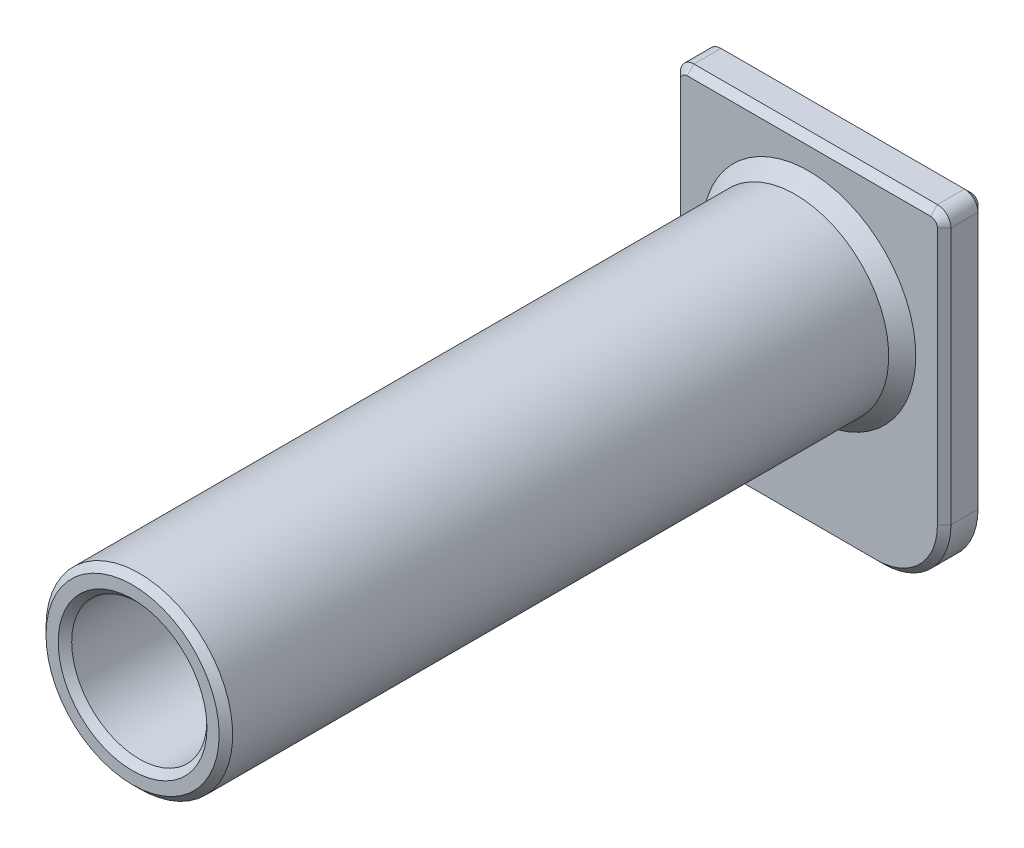
ISO-10303-21;
HEADER;
FILE_DESCRIPTION(('STEP AP214'),'2;1');
FILE_NAME('part.step','',(''),(''),'','','');
FILE_SCHEMA(('AUTOMOTIVE_DESIGN { 1 0 10303 214 1 1 1 1 }'));
ENDSEC;
DATA;
#1=APPLICATION_CONTEXT('core data for automotive mechanical design processes');
#2=APPLICATION_PROTOCOL_DEFINITION('international standard','automotive_design',2000,#1);
#3=PRODUCT_CONTEXT('',#1,'mechanical');
#4=PRODUCT('Part','Part','',(#3));
#5=PRODUCT_RELATED_PRODUCT_CATEGORY('part','',(#4));
#6=PRODUCT_DEFINITION_FORMATION('','',#4);
#7=PRODUCT_DEFINITION_CONTEXT('part definition',#1,'design');
#8=PRODUCT_DEFINITION('design','',#6,#7);
#9=PRODUCT_DEFINITION_SHAPE('','',#8);
#10=(LENGTH_UNIT() NAMED_UNIT(*) SI_UNIT(.MILLI.,.METRE.));
#11=(NAMED_UNIT(*) PLANE_ANGLE_UNIT() SI_UNIT($,.RADIAN.));
#12=(NAMED_UNIT(*) SI_UNIT($,.STERADIAN.) SOLID_ANGLE_UNIT());
#13=UNCERTAINTY_MEASURE_WITH_UNIT(LENGTH_MEASURE(1.E-05),#10,'distance_accuracy_value','');
#14=(GEOMETRIC_REPRESENTATION_CONTEXT(3) GLOBAL_UNCERTAINTY_ASSIGNED_CONTEXT((#13)) GLOBAL_UNIT_ASSIGNED_CONTEXT((#10,
#11,#12)) REPRESENTATION_CONTEXT('',''));
#15=CARTESIAN_POINT('',(0.,0.,0.));
#16=DIRECTION('',(0.,0.,1.));
#17=DIRECTION('',(1.,0.,0.));
#18=AXIS2_PLACEMENT_3D('',#15,#16,#17);
#19=CARTESIAN_POINT('',(0.,138.860814374171,3.));
#20=DIRECTION('',(0.,1.,0.));
#21=DIRECTION('',(0.,0.,1.));
#22=AXIS2_PLACEMENT_3D('',#19,#20,#21);
#23=PLANE('',#22);
#24=DIRECTION('',(0.,0.,-1.));
#25=VECTOR('',#24,1.);
#26=CARTESIAN_POINT('',(102.765440340665,138.860814374171,3.));
#27=LINE('',#26,#25);
#28=CARTESIAN_POINT('',(102.765440340665,138.860814374171,2.5));
#29=VERTEX_POINT('',#28);
#30=CARTESIAN_POINT('',(102.765440340665,138.860814374171,0.500000000000014));
#31=VERTEX_POINT('',#30);
#32=EDGE_CURVE('E172',#29,#31,#27,.T.);
#33=ORIENTED_EDGE('',*,*,#32,.F.);
#34=DIRECTION('',(1.,0.,0.));
#35=VECTOR('',#34,1.);
#36=CARTESIAN_POINT('',(0.,138.860814374171,2.5));
#37=LINE('',#36,#35);
#38=CARTESIAN_POINT('',(120.765440340665,138.860814374171,2.5));
#39=VERTEX_POINT('',#38);
#40=EDGE_CURVE('E170',#29,#39,#37,.T.);
#41=ORIENTED_EDGE('',*,*,#40,.T.);
#42=DIRECTION('',(0.,0.,-1.));
#43=VECTOR('',#42,1.);
#44=CARTESIAN_POINT('',(120.765440340665,138.860814374171,3.));
#45=LINE('',#44,#43);
#46=CARTESIAN_POINT('',(120.765440340665,138.860814374171,0.500000000000014));
#47=VERTEX_POINT('',#46);
#48=EDGE_CURVE('E166',#39,#47,#45,.T.);
#49=ORIENTED_EDGE('',*,*,#48,.T.);
#50=DIRECTION('',(-1.,0.,0.));
#51=VECTOR('',#50,1.);
#52=CARTESIAN_POINT('',(102.765440340665,138.860814374171,0.500000000000014));
#53=LINE('',#52,#51);
#54=EDGE_CURVE('E180',#47,#31,#53,.T.);
#55=ORIENTED_EDGE('',*,*,#54,.T.);
#56=EDGE_LOOP('',(#33,#41,#49,#55));
#57=FACE_BOUND('',#56,.T.);
#58=ADVANCED_FACE('F51',(#57),#23,.T.);
#59=CARTESIAN_POINT('',(102.765440340665,137.860814374171,3.));
#60=DIRECTION('',(0.,0.,-1.));
#61=DIRECTION('',(-1.,0.,0.));
#62=AXIS2_PLACEMENT_3D('',#59,#60,#61);
#63=CYLINDRICAL_SURFACE('',#62,1.);
#64=DIRECTION('',(0.,0.,-1.));
#65=VECTOR('',#64,1.);
#66=CARTESIAN_POINT('',(101.765440340665,137.860814374171,3.));
#67=LINE('',#66,#65);
#68=CARTESIAN_POINT('',(101.765440340665,137.860814374171,2.5));
#69=VERTEX_POINT('',#68);
#70=CARTESIAN_POINT('',(101.765440340665,137.860814374171,0.500000000000014));
#71=VERTEX_POINT('',#70);
#72=EDGE_CURVE('E580',#69,#71,#67,.T.);
#73=ORIENTED_EDGE('',*,*,#72,.F.);
#74=CARTESIAN_POINT('',(102.765440340665,137.860814374171,2.5));
#75=DIRECTION('',(0.,0.,1.));
#76=DIRECTION('',(1.,0.,0.));
#77=AXIS2_PLACEMENT_3D('',#74,#75,#76);
#78=CIRCLE('',#77,1.);
#79=EDGE_CURVE('E272',#69,#29,#78,.F.);
#80=ORIENTED_EDGE('',*,*,#79,.T.);
#81=ORIENTED_EDGE('',*,*,#32,.T.);
#82=CARTESIAN_POINT('',(102.765440340665,137.860814374171,0.500000000000014));
#83=DIRECTION('',(0.,0.,1.));
#84=DIRECTION('',(1.,0.,0.));
#85=AXIS2_PLACEMENT_3D('',#82,#83,#84);
#86=CIRCLE('',#85,1.);
#87=EDGE_CURVE('E267',#31,#71,#86,.T.);
#88=ORIENTED_EDGE('',*,*,#87,.T.);
#89=EDGE_LOOP('',(#73,#80,#81,#88));
#90=FACE_BOUND('',#89,.T.);
#91=ADVANCED_FACE('F388',(#90),#63,.T.);
#92=CARTESIAN_POINT('',(101.765440340665,0.,3.));
#93=DIRECTION('',(1.,0.,0.));
#94=DIRECTION('',(0.,0.,-1.));
#95=AXIS2_PLACEMENT_3D('',#92,#93,#94);
#96=PLANE('',#95);
#97=DIRECTION('',(0.,0.,-1.));
#98=VECTOR('',#97,1.);
#99=CARTESIAN_POINT('',(101.765440340665,118.860814374171,3.));
#100=LINE('',#99,#98);
#101=CARTESIAN_POINT('',(101.765440340665,118.860814374171,2.5));
#102=VERTEX_POINT('',#101);
#103=CARTESIAN_POINT('',(101.765440340665,118.860814374171,0.500000000000014));
#104=VERTEX_POINT('',#103);
#105=EDGE_CURVE('E571',#102,#104,#100,.T.);
#106=ORIENTED_EDGE('',*,*,#105,.F.);
#107=DIRECTION('',(0.,1.,0.));
#108=VECTOR('',#107,1.);
#109=CARTESIAN_POINT('',(101.765440340665,137.860814374171,2.5));
#110=LINE('',#109,#108);
#111=EDGE_CURVE('E266',#102,#69,#110,.T.);
#112=ORIENTED_EDGE('',*,*,#111,.T.);
#113=ORIENTED_EDGE('',*,*,#72,.T.);
#114=DIRECTION('',(0.,-1.,0.));
#115=VECTOR('',#114,1.);
#116=CARTESIAN_POINT('',(101.765440340665,0.,0.500000000000014));
#117=LINE('',#116,#115);
#118=EDGE_CURVE('E263',#71,#104,#117,.T.);
#119=ORIENTED_EDGE('',*,*,#118,.T.);
#120=EDGE_LOOP('',(#106,#112,#113,#119));
#121=FACE_BOUND('',#120,.T.);
#122=ADVANCED_FACE('F393',(#121),#96,.F.);
#123=CARTESIAN_POINT('',(106.765440340665,118.860814374171,3.));
#124=DIRECTION('',(0.,0.,-1.));
#125=DIRECTION('',(-1.,0.,0.));
#126=AXIS2_PLACEMENT_3D('',#123,#124,#125);
#127=CYLINDRICAL_SURFACE('',#126,5.);
#128=DIRECTION('',(0.,0.,-1.));
#129=VECTOR('',#128,1.);
#130=CARTESIAN_POINT('',(106.765440340665,113.860814374171,3.));
#131=LINE('',#130,#129);
#132=CARTESIAN_POINT('',(106.765440340665,113.860814374171,2.5));
#133=VERTEX_POINT('',#132);
#134=CARTESIAN_POINT('',(106.765440340665,113.860814374171,0.500000000000014));
#135=VERTEX_POINT('',#134);
#136=EDGE_CURVE('E576',#133,#135,#131,.T.);
#137=ORIENTED_EDGE('',*,*,#136,.F.);
#138=CARTESIAN_POINT('',(106.765440340665,118.860814374171,2.5));
#139=DIRECTION('',(0.,0.,1.));
#140=DIRECTION('',(1.,0.,0.));
#141=AXIS2_PLACEMENT_3D('',#138,#139,#140);
#142=CIRCLE('',#141,5.);
#143=EDGE_CURVE('E257',#133,#102,#142,.F.);
#144=ORIENTED_EDGE('',*,*,#143,.T.);
#145=ORIENTED_EDGE('',*,*,#105,.T.);
#146=CARTESIAN_POINT('',(106.765440340665,118.860814374171,0.500000000000014));
#147=DIRECTION('',(0.,0.,1.));
#148=DIRECTION('',(1.,0.,0.));
#149=AXIS2_PLACEMENT_3D('',#146,#147,#148);
#150=CIRCLE('',#149,5.);
#151=EDGE_CURVE('E260',#104,#135,#150,.T.);
#152=ORIENTED_EDGE('',*,*,#151,.T.);
#153=EDGE_LOOP('',(#137,#144,#145,#152));
#154=FACE_BOUND('',#153,.T.);
#155=ADVANCED_FACE('F564',(#154),#127,.T.);
#156=CARTESIAN_POINT('',(0.,113.860814374171,3.));
#157=DIRECTION('',(0.,1.,0.));
#158=DIRECTION('',(0.,0.,1.));
#159=AXIS2_PLACEMENT_3D('',#156,#157,#158);
#160=PLANE('',#159);
#161=DIRECTION('',(0.,0.,-1.));
#162=VECTOR('',#161,1.);
#163=CARTESIAN_POINT('',(116.765440340665,113.860814374171,3.));
#164=LINE('',#163,#162);
#165=CARTESIAN_POINT('',(116.765440340665,113.860814374171,2.5));
#166=VERTEX_POINT('',#165);
#167=CARTESIAN_POINT('',(116.765440340665,113.860814374171,0.500000000000014));
#168=VERTEX_POINT('',#167);
#169=EDGE_CURVE('E598',#166,#168,#164,.T.);
#170=ORIENTED_EDGE('',*,*,#169,.F.);
#171=DIRECTION('',(-1.,0.,0.));
#172=VECTOR('',#171,1.);
#173=CARTESIAN_POINT('',(106.765440340665,113.860814374171,2.5));
#174=LINE('',#173,#172);
#175=EDGE_CURVE('E255',#166,#133,#174,.T.);
#176=ORIENTED_EDGE('',*,*,#175,.T.);
#177=ORIENTED_EDGE('',*,*,#136,.T.);
#178=DIRECTION('',(1.,0.,0.));
#179=VECTOR('',#178,1.);
#180=CARTESIAN_POINT('',(0.,113.860814374171,0.500000000000014));
#181=LINE('',#180,#179);
#182=EDGE_CURVE('E253',#135,#168,#181,.T.);
#183=ORIENTED_EDGE('',*,*,#182,.T.);
#184=EDGE_LOOP('',(#170,#176,#177,#183));
#185=FACE_BOUND('',#184,.T.);
#186=ADVANCED_FACE('F559',(#185),#160,.F.);
#187=CARTESIAN_POINT('',(116.765440340665,118.860814374171,3.));
#188=DIRECTION('',(0.,0.,-1.));
#189=DIRECTION('',(-1.,0.,0.));
#190=AXIS2_PLACEMENT_3D('',#187,#188,#189);
#191=CYLINDRICAL_SURFACE('',#190,5.);
#192=DIRECTION('',(0.,0.,-1.));
#193=VECTOR('',#192,1.);
#194=CARTESIAN_POINT('',(121.765440340665,118.860814374171,3.));
#195=LINE('',#194,#193);
#196=CARTESIAN_POINT('',(121.765440340665,118.860814374171,2.5));
#197=VERTEX_POINT('',#196);
#198=CARTESIAN_POINT('',(121.765440340665,118.860814374171,0.500000000000014));
#199=VERTEX_POINT('',#198);
#200=EDGE_CURVE('E605',#197,#199,#195,.T.);
#201=ORIENTED_EDGE('',*,*,#200,.F.);
#202=CARTESIAN_POINT('',(116.765440340665,118.860814374171,2.5));
#203=DIRECTION('',(0.,0.,1.));
#204=DIRECTION('',(1.,0.,0.));
#205=AXIS2_PLACEMENT_3D('',#202,#203,#204);
#206=CIRCLE('',#205,5.);
#207=EDGE_CURVE('E247',#197,#166,#206,.F.);
#208=ORIENTED_EDGE('',*,*,#207,.T.);
#209=ORIENTED_EDGE('',*,*,#169,.T.);
#210=CARTESIAN_POINT('',(116.765440340665,118.860814374171,0.500000000000014));
#211=DIRECTION('',(0.,0.,1.));
#212=DIRECTION('',(1.,0.,0.));
#213=AXIS2_PLACEMENT_3D('',#210,#211,#212);
#214=CIRCLE('',#213,5.);
#215=EDGE_CURVE('E245',#168,#199,#214,.T.);
#216=ORIENTED_EDGE('',*,*,#215,.T.);
#217=EDGE_LOOP('',(#201,#208,#209,#216));
#218=FACE_BOUND('',#217,.T.);
#219=ADVANCED_FACE('F551',(#218),#191,.T.);
#220=CARTESIAN_POINT('',(121.765440340665,0.,3.));
#221=DIRECTION('',(1.,0.,0.));
#222=DIRECTION('',(0.,1.,0.));
#223=AXIS2_PLACEMENT_3D('',#220,#221,#222);
#224=PLANE('',#223);
#225=DIRECTION('',(0.,0.,-1.));
#226=VECTOR('',#225,1.);
#227=CARTESIAN_POINT('',(121.765440340665,137.860814374171,3.));
#228=LINE('',#227,#226);
#229=CARTESIAN_POINT('',(121.765440340665,137.860814374171,2.5));
#230=VERTEX_POINT('',#229);
#231=CARTESIAN_POINT('',(121.765440340665,137.860814374171,0.500000000000014));
#232=VERTEX_POINT('',#231);
#233=EDGE_CURVE('E193',#230,#232,#228,.T.);
#234=ORIENTED_EDGE('',*,*,#233,.F.);
#235=DIRECTION('',(0.,-1.,0.));
#236=VECTOR('',#235,1.);
#237=CARTESIAN_POINT('',(121.765440340665,0.,2.5));
#238=LINE('',#237,#236);
#239=EDGE_CURVE('E242',#230,#197,#238,.T.);
#240=ORIENTED_EDGE('',*,*,#239,.T.);
#241=ORIENTED_EDGE('',*,*,#200,.T.);
#242=DIRECTION('',(0.,1.,0.));
#243=VECTOR('',#242,1.);
#244=CARTESIAN_POINT('',(121.765440340665,137.860814374171,0.500000000000014));
#245=LINE('',#244,#243);
#246=EDGE_CURVE('E239',#199,#232,#245,.T.);
#247=ORIENTED_EDGE('',*,*,#246,.T.);
#248=EDGE_LOOP('',(#234,#240,#241,#247));
#249=FACE_BOUND('',#248,.T.);
#250=ADVANCED_FACE('F552',(#249),#224,.T.);
#251=CARTESIAN_POINT('',(120.765440340665,137.860814374171,3.));
#252=DIRECTION('',(0.,0.,-1.));
#253=DIRECTION('',(-1.,0.,0.));
#254=AXIS2_PLACEMENT_3D('',#251,#252,#253);
#255=CYLINDRICAL_SURFACE('',#254,1.);
#256=ORIENTED_EDGE('',*,*,#48,.F.);
#257=CARTESIAN_POINT('',(120.765440340665,137.860814374171,2.5));
#258=DIRECTION('',(0.,0.,1.));
#259=DIRECTION('',(1.,0.,0.));
#260=AXIS2_PLACEMENT_3D('',#257,#258,#259);
#261=CIRCLE('',#260,1.);
#262=EDGE_CURVE('E186',#39,#230,#261,.F.);
#263=ORIENTED_EDGE('',*,*,#262,.T.);
#264=ORIENTED_EDGE('',*,*,#233,.T.);
#265=CARTESIAN_POINT('',(120.765440340665,137.860814374171,0.500000000000014));
#266=DIRECTION('',(0.,0.,1.));
#267=DIRECTION('',(1.,0.,0.));
#268=AXIS2_PLACEMENT_3D('',#265,#266,#267);
#269=CIRCLE('',#268,1.);
#270=EDGE_CURVE('E188',#232,#47,#269,.T.);
#271=ORIENTED_EDGE('',*,*,#270,.T.);
#272=EDGE_LOOP('',(#256,#263,#264,#271));
#273=FACE_BOUND('',#272,.T.);
#274=ADVANCED_FACE('F181',(#273),#255,.T.);
#275=CARTESIAN_POINT('',(0.,0.,3.));
#276=DIRECTION('',(0.,0.,1.));
#277=DIRECTION('',(1.,0.,0.));
#278=AXIS2_PLACEMENT_3D('',#275,#276,#277);
#279=PLANE('',#278);
#280=CARTESIAN_POINT('',(111.765440340665,128.860814374171,3.));
#281=DIRECTION('',(0.,0.,1.));
#282=DIRECTION('',(1.,0.,0.));
#283=AXIS2_PLACEMENT_3D('',#280,#281,#282);
#284=CIRCLE('',#283,7.90000000000003);
#285=CARTESIAN_POINT('',(119.665440340665,128.860814374171,3.));
#286=VERTEX_POINT('',#285);
#287=EDGE_CURVE('E11',#286,#286,#284,.F.);
#288=ORIENTED_EDGE('',*,*,#287,.T.);
#289=EDGE_LOOP('',(#288));
#290=FACE_BOUND('',#289,.T.);
#291=DIRECTION('',(0.,1.,0.));
#292=VECTOR('',#291,1.);
#293=CARTESIAN_POINT('',(121.265440340665,0.,3.));
#294=LINE('',#293,#292);
#295=CARTESIAN_POINT('',(121.265440340665,118.860814374171,3.));
#296=VERTEX_POINT('',#295);
#297=CARTESIAN_POINT('',(121.265440340665,137.860814374171,3.));
#298=VERTEX_POINT('',#297);
#299=EDGE_CURVE('E232',#296,#298,#294,.T.);
#300=ORIENTED_EDGE('',*,*,#299,.T.);
#301=CARTESIAN_POINT('',(120.765440340665,137.860814374171,3.));
#302=DIRECTION('',(0.,0.,1.));
#303=DIRECTION('',(1.,0.,0.));
#304=AXIS2_PLACEMENT_3D('',#301,#302,#303);
#305=CIRCLE('',#304,0.5);
#306=CARTESIAN_POINT('',(120.765440340665,138.360814374171,3.));
#307=VERTEX_POINT('',#306);
#308=EDGE_CURVE('E237',#298,#307,#305,.T.);
#309=ORIENTED_EDGE('',*,*,#308,.T.);
#310=DIRECTION('',(-1.,0.,0.));
#311=VECTOR('',#310,1.);
#312=CARTESIAN_POINT('',(0.,138.360814374171,3.));
#313=LINE('',#312,#311);
#314=CARTESIAN_POINT('',(102.765440340665,138.360814374171,3.));
#315=VERTEX_POINT('',#314);
#316=EDGE_CURVE('E197',#307,#315,#313,.T.);
#317=ORIENTED_EDGE('',*,*,#316,.T.);
#318=CARTESIAN_POINT('',(102.765440340665,137.860814374171,3.));
#319=DIRECTION('',(0.,0.,1.));
#320=DIRECTION('',(1.,0.,0.));
#321=AXIS2_PLACEMENT_3D('',#318,#319,#320);
#322=CIRCLE('',#321,0.5);
#323=CARTESIAN_POINT('',(102.265440340665,137.860814374171,3.));
#324=VERTEX_POINT('',#323);
#325=EDGE_CURVE('E213',#315,#324,#322,.T.);
#326=ORIENTED_EDGE('',*,*,#325,.T.);
#327=DIRECTION('',(0.,-1.,0.));
#328=VECTOR('',#327,1.);
#329=CARTESIAN_POINT('',(102.265440340665,118.860814374171,3.));
#330=LINE('',#329,#328);
#331=CARTESIAN_POINT('',(102.265440340665,118.860814374171,3.));
#332=VERTEX_POINT('',#331);
#333=EDGE_CURVE('E222',#324,#332,#330,.T.);
#334=ORIENTED_EDGE('',*,*,#333,.T.);
#335=CARTESIAN_POINT('',(106.765440340665,118.860814374171,3.));
#336=DIRECTION('',(0.,0.,1.));
#337=DIRECTION('',(1.,0.,0.));
#338=AXIS2_PLACEMENT_3D('',#335,#336,#337);
#339=CIRCLE('',#338,4.5);
#340=CARTESIAN_POINT('',(106.765440340665,114.360814374171,3.));
#341=VERTEX_POINT('',#340);
#342=EDGE_CURVE('E221',#332,#341,#339,.T.);
#343=ORIENTED_EDGE('',*,*,#342,.T.);
#344=DIRECTION('',(1.,0.,0.));
#345=VECTOR('',#344,1.);
#346=CARTESIAN_POINT('',(116.765440340665,114.360814374171,3.));
#347=LINE('',#346,#345);
#348=CARTESIAN_POINT('',(116.765440340665,114.360814374171,3.));
#349=VERTEX_POINT('',#348);
#350=EDGE_CURVE('E227',#341,#349,#347,.T.);
#351=ORIENTED_EDGE('',*,*,#350,.T.);
#352=CARTESIAN_POINT('',(116.765440340665,118.860814374171,3.));
#353=DIRECTION('',(0.,0.,1.));
#354=DIRECTION('',(1.,0.,0.));
#355=AXIS2_PLACEMENT_3D('',#352,#353,#354);
#356=CIRCLE('',#355,4.5);
#357=EDGE_CURVE('E230',#349,#296,#356,.T.);
#358=ORIENTED_EDGE('',*,*,#357,.T.);
#359=EDGE_LOOP('',(#300,#309,#317,#326,#334,#343,#351,#358));
#360=FACE_BOUND('',#359,.T.);
#361=ADVANCED_FACE('F545',(#290,#360),#279,.T.);
#362=CARTESIAN_POINT('',(0.,0.,0.));
#363=DIRECTION('',(0.,0.,1.));
#364=DIRECTION('',(1.,0.,0.));
#365=AXIS2_PLACEMENT_3D('',#362,#363,#364);
#366=PLANE('',#365);
#367=CARTESIAN_POINT('',(111.765440340665,128.860814374171,0.));
#368=DIRECTION('',(0.,0.,1.));
#369=DIRECTION('',(1.,0.,0.));
#370=AXIS2_PLACEMENT_3D('',#367,#368,#369);
#371=CIRCLE('',#370,5.50000000000002);
#372=CARTESIAN_POINT('',(117.265440340665,128.860814374171,0.));
#373=VERTEX_POINT('',#372);
#374=EDGE_CURVE('E299',#373,#373,#371,.T.);
#375=ORIENTED_EDGE('',*,*,#374,.T.);
#376=EDGE_LOOP('',(#375));
#377=FACE_BOUND('',#376,.T.);
#378=DIRECTION('',(0.,1.,0.));
#379=VECTOR('',#378,1.);
#380=CARTESIAN_POINT('',(102.265440340665,0.,0.));
#381=LINE('',#380,#379);
#382=CARTESIAN_POINT('',(102.265440340665,118.860814374171,0.));
#383=VERTEX_POINT('',#382);
#384=CARTESIAN_POINT('',(102.265440340665,137.860814374171,0.));
#385=VERTEX_POINT('',#384);
#386=EDGE_CURVE('E67',#383,#385,#381,.T.);
#387=ORIENTED_EDGE('',*,*,#386,.T.);
#388=CARTESIAN_POINT('',(102.765440340665,137.860814374171,0.));
#389=DIRECTION('',(0.,0.,1.));
#390=DIRECTION('',(1.,0.,0.));
#391=AXIS2_PLACEMENT_3D('',#388,#389,#390);
#392=CIRCLE('',#391,0.499999999999973);
#393=CARTESIAN_POINT('',(102.765440340665,138.360814374171,0.));
#394=VERTEX_POINT('',#393);
#395=EDGE_CURVE('E293',#385,#394,#392,.F.);
#396=ORIENTED_EDGE('',*,*,#395,.T.);
#397=DIRECTION('',(1.,0.,0.));
#398=VECTOR('',#397,1.);
#399=CARTESIAN_POINT('',(120.765440340665,138.360814374171,0.));
#400=LINE('',#399,#398);
#401=CARTESIAN_POINT('',(120.765440340665,138.360814374171,0.));
#402=VERTEX_POINT('',#401);
#403=EDGE_CURVE('E177',#394,#402,#400,.T.);
#404=ORIENTED_EDGE('',*,*,#403,.T.);
#405=CARTESIAN_POINT('',(120.765440340665,137.860814374171,0.));
#406=DIRECTION('',(0.,0.,1.));
#407=DIRECTION('',(1.,0.,0.));
#408=AXIS2_PLACEMENT_3D('',#405,#406,#407);
#409=CIRCLE('',#408,0.499999999999973);
#410=CARTESIAN_POINT('',(121.265440340665,137.860814374171,0.));
#411=VERTEX_POINT('',#410);
#412=EDGE_CURVE('E278',#402,#411,#409,.F.);
#413=ORIENTED_EDGE('',*,*,#412,.T.);
#414=DIRECTION('',(0.,-1.,0.));
#415=VECTOR('',#414,1.);
#416=CARTESIAN_POINT('',(121.265440340665,118.860814374171,0.));
#417=LINE('',#416,#415);
#418=CARTESIAN_POINT('',(121.265440340665,118.860814374171,0.));
#419=VERTEX_POINT('',#418);
#420=EDGE_CURVE('E284',#411,#419,#417,.T.);
#421=ORIENTED_EDGE('',*,*,#420,.T.);
#422=CARTESIAN_POINT('',(116.765440340665,118.860814374171,0.));
#423=DIRECTION('',(0.,0.,1.));
#424=DIRECTION('',(1.,0.,0.));
#425=AXIS2_PLACEMENT_3D('',#422,#423,#424);
#426=CIRCLE('',#425,4.49999999999998);
#427=CARTESIAN_POINT('',(116.765440340665,114.360814374171,0.));
#428=VERTEX_POINT('',#427);
#429=EDGE_CURVE('E288',#419,#428,#426,.F.);
#430=ORIENTED_EDGE('',*,*,#429,.T.);
#431=DIRECTION('',(-1.,0.,0.));
#432=VECTOR('',#431,1.);
#433=CARTESIAN_POINT('',(0.,114.360814374171,0.));
#434=LINE('',#433,#432);
#435=CARTESIAN_POINT('',(106.765440340665,114.360814374171,0.));
#436=VERTEX_POINT('',#435);
#437=EDGE_CURVE('E290',#428,#436,#434,.T.);
#438=ORIENTED_EDGE('',*,*,#437,.T.);
#439=CARTESIAN_POINT('',(106.765440340665,118.860814374171,0.));
#440=DIRECTION('',(0.,0.,1.));
#441=DIRECTION('',(1.,0.,0.));
#442=AXIS2_PLACEMENT_3D('',#439,#440,#441);
#443=CIRCLE('',#442,4.49999999999998);
#444=EDGE_CURVE('E71',#436,#383,#443,.F.);
#445=ORIENTED_EDGE('',*,*,#444,.T.);
#446=EDGE_LOOP('',(#387,#396,#404,#413,#421,#430,#438,#445));
#447=FACE_BOUND('',#446,.T.);
#448=ADVANCED_FACE('F537',(#377,#447),#366,.F.);
#449=CARTESIAN_POINT('',(111.765440340665,128.860814374171,53.));
#450=DIRECTION('',(0.,0.,1.));
#451=DIRECTION('',(1.,0.,0.));
#452=AXIS2_PLACEMENT_3D('',#449,#450,#451);
#453=PLANE('',#452);
#454=CARTESIAN_POINT('',(111.765440340665,128.860814374171,53.));
#455=DIRECTION('',(0.,0.,1.));
#456=DIRECTION('',(1.,0.,0.));
#457=AXIS2_PLACEMENT_3D('',#454,#455,#456);
#458=CIRCLE('',#457,5.50000000000003);
#459=CARTESIAN_POINT('',(117.265440340665,128.860814374171,53.));
#460=VERTEX_POINT('',#459);
#461=EDGE_CURVE('E314',#460,#460,#458,.F.);
#462=ORIENTED_EDGE('',*,*,#461,.T.);
#463=EDGE_LOOP('',(#462));
#464=FACE_BOUND('',#463,.T.);
#465=CARTESIAN_POINT('',(111.765440340665,128.860814374171,53.));
#466=DIRECTION('',(0.,0.,1.));
#467=DIRECTION('',(1.,0.,0.));
#468=AXIS2_PLACEMENT_3D('',#465,#466,#467);
#469=CIRCLE('',#468,6.4);
#470=CARTESIAN_POINT('',(118.165440340665,128.860814374171,53.));
#471=VERTEX_POINT('',#470);
#472=EDGE_CURVE('E309',#471,#471,#469,.T.);
#473=ORIENTED_EDGE('',*,*,#472,.T.);
#474=EDGE_LOOP('',(#473));
#475=FACE_BOUND('',#474,.T.);
#476=ADVANCED_FACE('F532',(#464,#475),#453,.T.);
#477=CARTESIAN_POINT('',(111.765440340665,128.860814374171,53.));
#478=DIRECTION('',(0.,0.,-1.));
#479=DIRECTION('',(-1.,0.,0.));
#480=AXIS2_PLACEMENT_3D('',#477,#478,#479);
#481=CYLINDRICAL_SURFACE('',#480,6.9);
#482=CARTESIAN_POINT('',(111.765440340665,128.860814374171,4.00000000000005));
#483=DIRECTION('',(0.,0.,1.));
#484=DIRECTION('',(1.,0.,0.));
#485=AXIS2_PLACEMENT_3D('',#482,#483,#484);
#486=CIRCLE('',#485,6.9);
#487=CARTESIAN_POINT('',(104.865440340665,128.860814374171,4.00000000000004));
#488=VERTEX_POINT('',#487);
#489=EDGE_CURVE('E61',#488,#488,#486,.T.);
#490=CARTESIAN_POINT('',(111.765440340665,128.860814374171,52.5));
#491=DIRECTION('',(0.,0.,1.));
#492=DIRECTION('',(1.,0.,0.));
#493=AXIS2_PLACEMENT_3D('',#490,#491,#492);
#494=CIRCLE('',#493,6.9);
#495=CARTESIAN_POINT('',(104.865440340665,128.860814374171,52.5));
#496=VERTEX_POINT('',#495);
#497=EDGE_CURVE('E318',#496,#496,#494,.F.);
#498=CARTESIAN_POINT('',(104.865440340665,128.860814374171,4.00000000000004));
#499=CARTESIAN_POINT('',(104.865440340665,128.860814374171,4.50520833333337));
#500=CARTESIAN_POINT('',(104.865440340665,128.860814374171,5.0104166666667));
#501=CARTESIAN_POINT('',(104.865440340665,128.860814374171,6.02083333333337));
#502=CARTESIAN_POINT('',(104.865440340665,128.860814374171,6.5260416666667));
#503=CARTESIAN_POINT('',(104.865440340665,128.860814374171,7.53645833333337));
#504=CARTESIAN_POINT('',(104.865440340665,128.860814374171,8.0416666666667));
#505=CARTESIAN_POINT('',(104.865440340665,128.860814374171,9.05208333333337));
#506=CARTESIAN_POINT('',(104.865440340665,128.860814374171,9.5572916666667));
#507=CARTESIAN_POINT('',(104.865440340665,128.860814374171,10.5677083333334));
#508=CARTESIAN_POINT('',(104.865440340665,128.860814374171,11.0729166666667));
#509=CARTESIAN_POINT('',(104.865440340665,128.860814374171,12.0833333333334));
#510=CARTESIAN_POINT('',(104.865440340665,128.860814374171,12.5885416666667));
#511=CARTESIAN_POINT('',(104.865440340665,128.860814374171,13.5989583333334));
#512=CARTESIAN_POINT('',(104.865440340665,128.860814374171,14.1041666666667));
#513=CARTESIAN_POINT('',(104.865440340665,128.860814374171,15.1145833333334));
#514=CARTESIAN_POINT('',(104.865440340665,128.860814374171,15.6197916666667));
#515=CARTESIAN_POINT('',(104.865440340665,128.860814374171,16.6302083333334));
#516=CARTESIAN_POINT('',(104.865440340665,128.860814374171,17.1354166666667));
#517=CARTESIAN_POINT('',(104.865440340665,128.860814374171,18.1458333333334));
#518=CARTESIAN_POINT('',(104.865440340665,128.860814374171,18.6510416666667));
#519=CARTESIAN_POINT('',(104.865440340665,128.860814374171,19.6614583333334));
#520=CARTESIAN_POINT('',(104.865440340665,128.860814374171,20.1666666666667));
#521=CARTESIAN_POINT('',(104.865440340665,128.860814374171,21.1770833333334));
#522=CARTESIAN_POINT('',(104.865440340665,128.860814374171,21.6822916666667));
#523=CARTESIAN_POINT('',(104.865440340665,128.860814374171,22.6927083333334));
#524=CARTESIAN_POINT('',(104.865440340665,128.860814374171,23.1979166666667));
#525=CARTESIAN_POINT('',(104.865440340665,128.860814374171,24.2083333333334));
#526=CARTESIAN_POINT('',(104.865440340665,128.860814374171,24.7135416666667));
#527=CARTESIAN_POINT('',(104.865440340665,128.860814374171,25.7239583333334));
#528=CARTESIAN_POINT('',(104.865440340665,128.860814374171,26.2291666666667));
#529=CARTESIAN_POINT('',(104.865440340665,128.860814374171,27.2395833333334));
#530=CARTESIAN_POINT('',(104.865440340665,128.860814374171,27.7447916666667));
#531=CARTESIAN_POINT('',(104.865440340665,128.860814374171,28.7552083333334));
#532=CARTESIAN_POINT('',(104.865440340665,128.860814374171,29.2604166666667));
#533=CARTESIAN_POINT('',(104.865440340665,128.860814374171,30.2708333333334));
#534=CARTESIAN_POINT('',(104.865440340665,128.860814374171,30.7760416666667));
#535=CARTESIAN_POINT('',(104.865440340665,128.860814374171,31.7864583333334));
#536=CARTESIAN_POINT('',(104.865440340665,128.860814374171,32.2916666666667));
#537=CARTESIAN_POINT('',(104.865440340665,128.860814374171,33.3020833333334));
#538=CARTESIAN_POINT('',(104.865440340665,128.860814374171,33.8072916666667));
#539=CARTESIAN_POINT('',(104.865440340665,128.860814374171,34.8177083333334));
#540=CARTESIAN_POINT('',(104.865440340665,128.860814374171,35.3229166666667));
#541=CARTESIAN_POINT('',(104.865440340665,128.860814374171,36.3333333333334));
#542=CARTESIAN_POINT('',(104.865440340665,128.860814374171,36.8385416666667));
#543=CARTESIAN_POINT('',(104.865440340665,128.860814374171,37.8489583333334));
#544=CARTESIAN_POINT('',(104.865440340665,128.860814374171,38.3541666666667));
#545=CARTESIAN_POINT('',(104.865440340665,128.860814374171,39.3645833333334));
#546=CARTESIAN_POINT('',(104.865440340665,128.860814374171,39.8697916666667));
#547=CARTESIAN_POINT('',(104.865440340665,128.860814374171,40.8802083333334));
#548=CARTESIAN_POINT('',(104.865440340665,128.860814374171,41.3854166666667));
#549=CARTESIAN_POINT('',(104.865440340665,128.860814374171,42.3958333333334));
#550=CARTESIAN_POINT('',(104.865440340665,128.860814374171,42.9010416666667));
#551=CARTESIAN_POINT('',(104.865440340665,128.860814374171,43.9114583333334));
#552=CARTESIAN_POINT('',(104.865440340665,128.860814374171,44.4166666666667));
#553=CARTESIAN_POINT('',(104.865440340665,128.860814374171,45.4270833333334));
#554=CARTESIAN_POINT('',(104.865440340665,128.860814374171,45.9322916666667));
#555=CARTESIAN_POINT('',(104.865440340665,128.860814374171,46.9427083333334));
#556=CARTESIAN_POINT('',(104.865440340665,128.860814374171,47.4479166666667));
#557=CARTESIAN_POINT('',(104.865440340665,128.860814374171,48.4583333333334));
#558=CARTESIAN_POINT('',(104.865440340665,128.860814374171,48.9635416666667));
#559=CARTESIAN_POINT('',(104.865440340665,128.860814374171,49.9739583333334));
#560=CARTESIAN_POINT('',(104.865440340665,128.860814374171,50.4791666666667));
#561=CARTESIAN_POINT('',(104.865440340665,128.860814374171,51.4895833333334));
#562=CARTESIAN_POINT('',(104.865440340665,128.860814374171,51.9947916666667));
#563=CARTESIAN_POINT('',(104.865440340665,128.860814374171,52.5));
#564=B_SPLINE_CURVE_WITH_KNOTS('',3,(#498,#499,#500,#501,#502,#503,#504,#505,#506,#507,#508,
#509,#510,#511,#512,#513,#514,#515,#516,#517,#518,#519,#520,#521,#522,#523,#524,#525,#526,#527,
#528,#529,#530,#531,#532,#533,#534,#535,#536,#537,#538,#539,#540,#541,#542,#543,#544,#545,#546,
#547,#548,#549,#550,#551,#552,#553,#554,#555,#556,#557,#558,#559,#560,#561,#562,#563),
.UNSPECIFIED.,.F.,.F.,(4,2,2,2,2,2,2,2,2,2,2,2,2,2,2,2,2,2,2,2,2,2,2,2,2,2,2,2,2,2,2,2,4),(0.,
1.515625,3.03125,4.546875,6.0625,7.57812500000001,9.09375,10.609375,12.125,13.640625,15.15625,
16.671875,18.1875,19.703125,21.21875,22.734375,24.25,25.765625,27.28125,28.796875,30.3125,
31.828125,33.34375,34.859375,36.375,37.890625,39.40625,40.921875,42.4375,43.953125,45.46875,
46.984375,48.5),.UNSPECIFIED.);
#565=EDGE_CURVE('BSEAM378',#488,#496,#564,.T.);
#566=ORIENTED_EDGE('',*,*,#489,.T.);
#567=ORIENTED_EDGE('',*,*,#497,.T.);
#568=ORIENTED_EDGE('',*,*,#565,.T.);
#569=ORIENTED_EDGE('',*,*,#565,.F.);
#570=EDGE_LOOP('',(#566,#568,#567,#569));
#571=FACE_BOUND('',#570,.T.);
#572=ADVANCED_FACE('F378',(#571),#481,.T.);
#573=CARTESIAN_POINT('',(111.765440340665,128.860814374171,53.));
#574=DIRECTION('',(0.,0.,-1.));
#575=DIRECTION('',(-1.,0.,0.));
#576=AXIS2_PLACEMENT_3D('',#573,#574,#575);
#577=CYLINDRICAL_SURFACE('',#576,5.00000000000001);
#578=CARTESIAN_POINT('',(111.765440340665,128.860814374171,0.5));
#579=DIRECTION('',(0.,0.,1.));
#580=DIRECTION('',(1.,0.,0.));
#581=AXIS2_PLACEMENT_3D('',#578,#579,#580);
#582=CIRCLE('',#581,5.00000000000001);
#583=CARTESIAN_POINT('',(106.765440340665,128.860814374171,0.499999999999994));
#584=VERTEX_POINT('',#583);
#585=EDGE_CURVE('E308',#584,#584,#582,.F.);
#586=CARTESIAN_POINT('',(111.765440340665,128.860814374171,52.5));
#587=DIRECTION('',(0.,0.,1.));
#588=DIRECTION('',(1.,0.,0.));
#589=AXIS2_PLACEMENT_3D('',#586,#587,#588);
#590=CIRCLE('',#589,5.00000000000001);
#591=CARTESIAN_POINT('',(106.765440340665,128.860814374171,52.5));
#592=VERTEX_POINT('',#591);
#593=EDGE_CURVE('E304',#592,#592,#590,.T.);
#594=CARTESIAN_POINT('',(106.765440340665,128.860814374171,0.499999999999994));
#595=CARTESIAN_POINT('',(106.765440340665,128.860814374171,1.04166666666666));
#596=CARTESIAN_POINT('',(106.765440340665,128.860814374171,1.58333333333333));
#597=CARTESIAN_POINT('',(106.765440340665,128.860814374171,2.66666666666666));
#598=CARTESIAN_POINT('',(106.765440340665,128.860814374171,3.20833333333333));
#599=CARTESIAN_POINT('',(106.765440340665,128.860814374171,4.29166666666666));
#600=CARTESIAN_POINT('',(106.765440340665,128.860814374171,4.83333333333333));
#601=CARTESIAN_POINT('',(106.765440340665,128.860814374171,5.91666666666666));
#602=CARTESIAN_POINT('',(106.765440340665,128.860814374171,6.45833333333333));
#603=CARTESIAN_POINT('',(106.765440340665,128.860814374171,7.54166666666666));
#604=CARTESIAN_POINT('',(106.765440340665,128.860814374171,8.08333333333333));
#605=CARTESIAN_POINT('',(106.765440340665,128.860814374171,9.16666666666666));
#606=CARTESIAN_POINT('',(106.765440340665,128.860814374171,9.70833333333333));
#607=CARTESIAN_POINT('',(106.765440340665,128.860814374171,10.7916666666667));
#608=CARTESIAN_POINT('',(106.765440340665,128.860814374171,11.3333333333333));
#609=CARTESIAN_POINT('',(106.765440340665,128.860814374171,12.4166666666667));
#610=CARTESIAN_POINT('',(106.765440340665,128.860814374171,12.9583333333333));
#611=CARTESIAN_POINT('',(106.765440340665,128.860814374171,14.0416666666667));
#612=CARTESIAN_POINT('',(106.765440340665,128.860814374171,14.5833333333333));
#613=CARTESIAN_POINT('',(106.765440340665,128.860814374171,15.6666666666667));
#614=CARTESIAN_POINT('',(106.765440340665,128.860814374171,16.2083333333333));
#615=CARTESIAN_POINT('',(106.765440340665,128.860814374171,17.2916666666667));
#616=CARTESIAN_POINT('',(106.765440340665,128.860814374171,17.8333333333333));
#617=CARTESIAN_POINT('',(106.765440340665,128.860814374171,18.9166666666667));
#618=CARTESIAN_POINT('',(106.765440340665,128.860814374171,19.4583333333333));
#619=CARTESIAN_POINT('',(106.765440340665,128.860814374171,20.5416666666667));
#620=CARTESIAN_POINT('',(106.765440340665,128.860814374171,21.0833333333333));
#621=CARTESIAN_POINT('',(106.765440340665,128.860814374171,22.1666666666667));
#622=CARTESIAN_POINT('',(106.765440340665,128.860814374171,22.7083333333333));
#623=CARTESIAN_POINT('',(106.765440340665,128.860814374171,23.7916666666667));
#624=CARTESIAN_POINT('',(106.765440340665,128.860814374171,24.3333333333333));
#625=CARTESIAN_POINT('',(106.765440340665,128.860814374171,25.4166666666667));
#626=CARTESIAN_POINT('',(106.765440340665,128.860814374171,25.9583333333333));
#627=CARTESIAN_POINT('',(106.765440340665,128.860814374171,27.0416666666667));
#628=CARTESIAN_POINT('',(106.765440340665,128.860814374171,27.5833333333333));
#629=CARTESIAN_POINT('',(106.765440340665,128.860814374171,28.6666666666667));
#630=CARTESIAN_POINT('',(106.765440340665,128.860814374171,29.2083333333333));
#631=CARTESIAN_POINT('',(106.765440340665,128.860814374171,30.2916666666667));
#632=CARTESIAN_POINT('',(106.765440340665,128.860814374171,30.8333333333333));
#633=CARTESIAN_POINT('',(106.765440340665,128.860814374171,31.9166666666667));
#634=CARTESIAN_POINT('',(106.765440340665,128.860814374171,32.4583333333333));
#635=CARTESIAN_POINT('',(106.765440340665,128.860814374171,33.5416666666667));
#636=CARTESIAN_POINT('',(106.765440340665,128.860814374171,34.0833333333333));
#637=CARTESIAN_POINT('',(106.765440340665,128.860814374171,35.1666666666667));
#638=CARTESIAN_POINT('',(106.765440340665,128.860814374171,35.7083333333333));
#639=CARTESIAN_POINT('',(106.765440340665,128.860814374171,36.7916666666667));
#640=CARTESIAN_POINT('',(106.765440340665,128.860814374171,37.3333333333333));
#641=CARTESIAN_POINT('',(106.765440340665,128.860814374171,38.4166666666667));
#642=CARTESIAN_POINT('',(106.765440340665,128.860814374171,38.9583333333333));
#643=CARTESIAN_POINT('',(106.765440340665,128.860814374171,40.0416666666667));
#644=CARTESIAN_POINT('',(106.765440340665,128.860814374171,40.5833333333333));
#645=CARTESIAN_POINT('',(106.765440340665,128.860814374171,41.6666666666667));
#646=CARTESIAN_POINT('',(106.765440340665,128.860814374171,42.2083333333333));
#647=CARTESIAN_POINT('',(106.765440340665,128.860814374171,43.2916666666667));
#648=CARTESIAN_POINT('',(106.765440340665,128.860814374171,43.8333333333333));
#649=CARTESIAN_POINT('',(106.765440340665,128.860814374171,44.9166666666667));
#650=CARTESIAN_POINT('',(106.765440340665,128.860814374171,45.4583333333333));
#651=CARTESIAN_POINT('',(106.765440340665,128.860814374171,46.5416666666667));
#652=CARTESIAN_POINT('',(106.765440340665,128.860814374171,47.0833333333333));
#653=CARTESIAN_POINT('',(106.765440340665,128.860814374171,48.1666666666667));
#654=CARTESIAN_POINT('',(106.765440340665,128.860814374171,48.7083333333333));
#655=CARTESIAN_POINT('',(106.765440340665,128.860814374171,49.7916666666667));
#656=CARTESIAN_POINT('',(106.765440340665,128.860814374171,50.3333333333333));
#657=CARTESIAN_POINT('',(106.765440340665,128.860814374171,51.4166666666667));
#658=CARTESIAN_POINT('',(106.765440340665,128.860814374171,51.9583333333333));
#659=CARTESIAN_POINT('',(106.765440340665,128.860814374171,52.5));
#660=B_SPLINE_CURVE_WITH_KNOTS('',3,(#594,#595,#596,#597,#598,#599,#600,#601,#602,#603,#604,
#605,#606,#607,#608,#609,#610,#611,#612,#613,#614,#615,#616,#617,#618,#619,#620,#621,#622,#623,
#624,#625,#626,#627,#628,#629,#630,#631,#632,#633,#634,#635,#636,#637,#638,#639,#640,#641,#642,
#643,#644,#645,#646,#647,#648,#649,#650,#651,#652,#653,#654,#655,#656,#657,#658,#659),
.UNSPECIFIED.,.F.,.F.,(4,2,2,2,2,2,2,2,2,2,2,2,2,2,2,2,2,2,2,2,2,2,2,2,2,2,2,2,2,2,2,2,4),(0.,
1.625,3.25,4.875,6.5,8.125,9.75,11.375,13.,14.625,16.25,17.875,19.5,21.125,22.75,24.375,26.,
27.625,29.25,30.875,32.5,34.125,35.75,37.375,39.,40.625,42.25,43.875,45.5,47.125,48.75,50.375,
52.),.UNSPECIFIED.);
#661=EDGE_CURVE('BSEAM454',#584,#592,#660,.T.);
#662=ORIENTED_EDGE('',*,*,#585,.T.);
#663=ORIENTED_EDGE('',*,*,#593,.T.);
#664=ORIENTED_EDGE('',*,*,#661,.T.);
#665=ORIENTED_EDGE('',*,*,#661,.F.);
#666=EDGE_LOOP('',(#662,#664,#663,#665));
#667=FACE_BOUND('',#666,.T.);
#668=ADVANCED_FACE('F454',(#667),#577,.F.);
#669=CARTESIAN_POINT('',(106.765440340665,118.860814374171,3.));
#670=DIRECTION('',(0.,0.,-1.));
#671=DIRECTION('',(-1.,0.,0.));
#672=AXIS2_PLACEMENT_3D('',#669,#670,#671);
#673=CONICAL_SURFACE('',#672,4.5,0.785398163397448);
#674=DIRECTION('',(0.,-0.707106781186547,-0.707106781186547));
#675=VECTOR('',#674,1.);
#676=CARTESIAN_POINT('',(106.765440340665,114.360814374171,3.));
#677=LINE('',#676,#675);
#678=EDGE_CURVE('E338',#341,#133,#677,.T.);
#679=ORIENTED_EDGE('',*,*,#678,.F.);
#680=ORIENTED_EDGE('',*,*,#342,.F.);
#681=DIRECTION('',(0.707106781186547,0.,0.707106781186547));
#682=VECTOR('',#681,1.);
#683=CARTESIAN_POINT('',(101.765440340665,118.860814374171,2.5));
#684=LINE('',#683,#682);
#685=EDGE_CURVE('E194',#102,#332,#684,.T.);
#686=ORIENTED_EDGE('',*,*,#685,.F.);
#687=ORIENTED_EDGE('',*,*,#143,.F.);
#688=EDGE_LOOP('',(#679,#680,#686,#687));
#689=FACE_BOUND('',#688,.T.);
#690=ADVANCED_FACE('F446',(#689),#673,.T.);
#691=CARTESIAN_POINT('',(102.265440340665,0.,3.));
#692=DIRECTION('',(-0.707106781186547,0.,0.707106781186547));
#693=DIRECTION('',(0.,1.,0.));
#694=AXIS2_PLACEMENT_3D('',#691,#692,#693);
#695=PLANE('',#694);
#696=ORIENTED_EDGE('',*,*,#685,.T.);
#697=ORIENTED_EDGE('',*,*,#333,.F.);
#698=DIRECTION('',(0.707106781186547,0.,0.707106781186547));
#699=VECTOR('',#698,1.);
#700=CARTESIAN_POINT('',(101.765440340665,137.860814374171,2.5));
#701=LINE('',#700,#699);
#702=EDGE_CURVE('E333',#69,#324,#701,.T.);
#703=ORIENTED_EDGE('',*,*,#702,.F.);
#704=ORIENTED_EDGE('',*,*,#111,.F.);
#705=EDGE_LOOP('',(#696,#697,#703,#704));
#706=FACE_BOUND('',#705,.T.);
#707=ADVANCED_FACE('F438',(#706),#695,.T.);
#708=CARTESIAN_POINT('',(0.,114.360814374171,3.));
#709=DIRECTION('',(0.,-0.707106781186547,0.707106781186547));
#710=DIRECTION('',(-1.,0.,0.));
#711=AXIS2_PLACEMENT_3D('',#708,#709,#710);
#712=PLANE('',#711);
#713=ORIENTED_EDGE('',*,*,#678,.T.);
#714=ORIENTED_EDGE('',*,*,#175,.F.);
#715=DIRECTION('',(0.,-0.707106781186547,-0.707106781186547));
#716=VECTOR('',#715,1.);
#717=CARTESIAN_POINT('',(116.765440340665,114.360814374171,3.));
#718=LINE('',#717,#716);
#719=EDGE_CURVE('E332',#349,#166,#718,.T.);
#720=ORIENTED_EDGE('',*,*,#719,.F.);
#721=ORIENTED_EDGE('',*,*,#350,.F.);
#722=EDGE_LOOP('',(#713,#714,#720,#721));
#723=FACE_BOUND('',#722,.T.);
#724=ADVANCED_FACE('F435',(#723),#712,.T.);
#725=CARTESIAN_POINT('',(102.765440340665,137.860814374171,3.));
#726=DIRECTION('',(0.,0.,-1.));
#727=DIRECTION('',(-1.,0.,0.));
#728=AXIS2_PLACEMENT_3D('',#725,#726,#727);
#729=CONICAL_SURFACE('',#728,0.5,0.785398163397448);
#730=ORIENTED_EDGE('',*,*,#702,.T.);
#731=ORIENTED_EDGE('',*,*,#325,.F.);
#732=DIRECTION('',(0.,-0.707106781186547,0.707106781186547));
#733=VECTOR('',#732,1.);
#734=CARTESIAN_POINT('',(102.765440340665,138.860814374171,2.5));
#735=LINE('',#734,#733);
#736=EDGE_CURVE('E327',#29,#315,#735,.T.);
#737=ORIENTED_EDGE('',*,*,#736,.F.);
#738=ORIENTED_EDGE('',*,*,#79,.F.);
#739=EDGE_LOOP('',(#730,#731,#737,#738));
#740=FACE_BOUND('',#739,.T.);
#741=ADVANCED_FACE('F422',(#740),#729,.T.);
#742=CARTESIAN_POINT('',(116.765440340665,118.860814374171,3.));
#743=DIRECTION('',(0.,0.,-1.));
#744=DIRECTION('',(-1.,0.,0.));
#745=AXIS2_PLACEMENT_3D('',#742,#743,#744);
#746=CONICAL_SURFACE('',#745,4.5,0.785398163397448);
#747=ORIENTED_EDGE('',*,*,#719,.T.);
#748=ORIENTED_EDGE('',*,*,#207,.F.);
#749=DIRECTION('',(0.707106781186547,0.,-0.707106781186547));
#750=VECTOR('',#749,1.);
#751=CARTESIAN_POINT('',(121.265440340665,118.860814374171,3.));
#752=LINE('',#751,#750);
#753=EDGE_CURVE('E205',#296,#197,#752,.T.);
#754=ORIENTED_EDGE('',*,*,#753,.F.);
#755=ORIENTED_EDGE('',*,*,#357,.F.);
#756=EDGE_LOOP('',(#747,#748,#754,#755));
#757=FACE_BOUND('',#756,.T.);
#758=ADVANCED_FACE('F420',(#757),#746,.T.);
#759=CARTESIAN_POINT('',(0.,138.860814374171,2.5));
#760=DIRECTION('',(0.,-0.707106781186547,-0.707106781186547));
#761=DIRECTION('',(1.,0.,0.));
#762=AXIS2_PLACEMENT_3D('',#759,#760,#761);
#763=PLANE('',#762);
#764=ORIENTED_EDGE('',*,*,#736,.T.);
#765=ORIENTED_EDGE('',*,*,#316,.F.);
#766=DIRECTION('',(0.,-0.707106781186547,0.707106781186547));
#767=VECTOR('',#766,1.);
#768=CARTESIAN_POINT('',(120.765440340665,138.860814374171,2.5));
#769=LINE('',#768,#767);
#770=EDGE_CURVE('E191',#39,#307,#769,.T.);
#771=ORIENTED_EDGE('',*,*,#770,.F.);
#772=ORIENTED_EDGE('',*,*,#40,.F.);
#773=EDGE_LOOP('',(#764,#765,#771,#772));
#774=FACE_BOUND('',#773,.T.);
#775=ADVANCED_FACE('F198',(#774),#763,.F.);
#776=CARTESIAN_POINT('',(121.765440340665,0.,2.5));
#777=DIRECTION('',(-0.707106781186547,0.,-0.707106781186547));
#778=DIRECTION('',(0.,-1.,0.));
#779=AXIS2_PLACEMENT_3D('',#776,#777,#778);
#780=PLANE('',#779);
#781=ORIENTED_EDGE('',*,*,#753,.T.);
#782=ORIENTED_EDGE('',*,*,#239,.F.);
#783=DIRECTION('',(0.707106781186547,0.,-0.707106781186547));
#784=VECTOR('',#783,1.);
#785=CARTESIAN_POINT('',(121.265440340665,137.860814374171,3.));
#786=LINE('',#785,#784);
#787=EDGE_CURVE('E201',#298,#230,#786,.T.);
#788=ORIENTED_EDGE('',*,*,#787,.F.);
#789=ORIENTED_EDGE('',*,*,#299,.F.);
#790=EDGE_LOOP('',(#781,#782,#788,#789));
#791=FACE_BOUND('',#790,.T.);
#792=ADVANCED_FACE('F407',(#791),#780,.F.);
#793=CARTESIAN_POINT('',(120.765440340665,137.860814374171,2.5));
#794=DIRECTION('',(0.,0.,-1.));
#795=DIRECTION('',(-1.,0.,0.));
#796=AXIS2_PLACEMENT_3D('',#793,#794,#795);
#797=CONICAL_SURFACE('',#796,1.,0.785398163397448);
#798=ORIENTED_EDGE('',*,*,#770,.T.);
#799=ORIENTED_EDGE('',*,*,#308,.F.);
#800=ORIENTED_EDGE('',*,*,#787,.T.);
#801=ORIENTED_EDGE('',*,*,#262,.F.);
#802=EDGE_LOOP('',(#798,#799,#800,#801));
#803=FACE_BOUND('',#802,.T.);
#804=ADVANCED_FACE('F202',(#803),#797,.T.);
#805=CARTESIAN_POINT('',(111.765440340665,128.860814374171,0.));
#806=DIRECTION('',(0.,0.,-1.));
#807=DIRECTION('',(-1.,0.,0.));
#808=AXIS2_PLACEMENT_3D('',#805,#806,#807);
#809=CONICAL_SURFACE('',#808,5.50000000000002,0.785398163397461);
#810=ORIENTED_EDGE('',*,*,#585,.F.);
#811=EDGE_LOOP('',(#810));
#812=FACE_BOUND('',#811,.T.);
#813=ORIENTED_EDGE('',*,*,#374,.F.);
#814=EDGE_LOOP('',(#813));
#815=FACE_BOUND('',#814,.T.);
#816=ADVANCED_FACE('F406',(#812,#815),#809,.F.);
#817=CARTESIAN_POINT('',(116.765440340665,118.860814374171,0.500000000000014));
#818=DIRECTION('',(0.,0.,1.));
#819=DIRECTION('',(1.,0.,0.));
#820=AXIS2_PLACEMENT_3D('',#817,#818,#819);
#821=CONICAL_SURFACE('',#820,5.,0.785398163397462);
#822=DIRECTION('',(0.,-0.707106781186557,0.707106781186538));
#823=VECTOR('',#822,1.);
#824=CARTESIAN_POINT('',(116.765440340665,114.360814374171,0.));
#825=LINE('',#824,#823);
#826=EDGE_CURVE('E366',#428,#168,#825,.T.);
#827=ORIENTED_EDGE('',*,*,#826,.F.);
#828=ORIENTED_EDGE('',*,*,#429,.F.);
#829=DIRECTION('',(-0.707106781186557,0.,-0.707106781186538));
#830=VECTOR('',#829,1.);
#831=CARTESIAN_POINT('',(121.765440340665,118.860814374171,0.500000000000014));
#832=LINE('',#831,#830);
#833=EDGE_CURVE('E323',#199,#419,#832,.T.);
#834=ORIENTED_EDGE('',*,*,#833,.F.);
#835=ORIENTED_EDGE('',*,*,#215,.F.);
#836=EDGE_LOOP('',(#827,#828,#834,#835));
#837=FACE_BOUND('',#836,.T.);
#838=ADVANCED_FACE('F459',(#837),#821,.T.);
#839=CARTESIAN_POINT('',(121.265440340665,0.,0.));
#840=DIRECTION('',(0.707106781186538,0.,-0.707106781186557));
#841=DIRECTION('',(0.,1.,0.));
#842=AXIS2_PLACEMENT_3D('',#839,#840,#841);
#843=PLANE('',#842);
#844=ORIENTED_EDGE('',*,*,#833,.T.);
#845=ORIENTED_EDGE('',*,*,#420,.F.);
#846=DIRECTION('',(-0.707106781186557,0.,-0.707106781186538));
#847=VECTOR('',#846,1.);
#848=CARTESIAN_POINT('',(121.765440340665,137.860814374171,0.500000000000014));
#849=LINE('',#848,#847);
#850=EDGE_CURVE('E365',#232,#411,#849,.T.);
#851=ORIENTED_EDGE('',*,*,#850,.F.);
#852=ORIENTED_EDGE('',*,*,#246,.F.);
#853=EDGE_LOOP('',(#844,#845,#851,#852));
#854=FACE_BOUND('',#853,.T.);
#855=ADVANCED_FACE('F503',(#854),#843,.T.);
#856=CARTESIAN_POINT('',(0.,113.860814374171,0.500000000000014));
#857=DIRECTION('',(0.,0.707106781186538,0.707106781186557));
#858=DIRECTION('',(1.,0.,0.));
#859=AXIS2_PLACEMENT_3D('',#856,#857,#858);
#860=PLANE('',#859);
#861=ORIENTED_EDGE('',*,*,#826,.T.);
#862=ORIENTED_EDGE('',*,*,#182,.F.);
#863=DIRECTION('',(0.,-0.707106781186557,0.707106781186538));
#864=VECTOR('',#863,1.);
#865=CARTESIAN_POINT('',(106.765440340665,114.360814374171,0.));
#866=LINE('',#865,#864);
#867=EDGE_CURVE('E356',#436,#135,#866,.T.);
#868=ORIENTED_EDGE('',*,*,#867,.F.);
#869=ORIENTED_EDGE('',*,*,#437,.F.);
#870=EDGE_LOOP('',(#861,#862,#868,#869));
#871=FACE_BOUND('',#870,.T.);
#872=ADVANCED_FACE('F500',(#871),#860,.F.);
#873=CARTESIAN_POINT('',(120.765440340665,137.860814374171,0.));
#874=DIRECTION('',(0.,0.,1.));
#875=DIRECTION('',(1.,0.,0.));
#876=AXIS2_PLACEMENT_3D('',#873,#874,#875);
#877=CONICAL_SURFACE('',#876,0.499999999999973,0.785398163397462);
#878=ORIENTED_EDGE('',*,*,#850,.T.);
#879=ORIENTED_EDGE('',*,*,#412,.F.);
#880=DIRECTION('',(0.,-0.707106781186557,-0.707106781186538));
#881=VECTOR('',#880,1.);
#882=CARTESIAN_POINT('',(120.765440340665,138.860814374171,0.500000000000014));
#883=LINE('',#882,#881);
#884=EDGE_CURVE('E358',#47,#402,#883,.T.);
#885=ORIENTED_EDGE('',*,*,#884,.F.);
#886=ORIENTED_EDGE('',*,*,#270,.F.);
#887=EDGE_LOOP('',(#878,#879,#885,#886));
#888=FACE_BOUND('',#887,.T.);
#889=ADVANCED_FACE('F489',(#888),#877,.T.);
#890=CARTESIAN_POINT('',(106.765440340665,118.860814374171,0.500000000000014));
#891=DIRECTION('',(0.,0.,1.));
#892=DIRECTION('',(1.,0.,0.));
#893=AXIS2_PLACEMENT_3D('',#890,#891,#892);
#894=CONICAL_SURFACE('',#893,5.,0.785398163397462);
#895=ORIENTED_EDGE('',*,*,#867,.T.);
#896=ORIENTED_EDGE('',*,*,#151,.F.);
#897=DIRECTION('',(-0.707106781186557,0.,0.707106781186538));
#898=VECTOR('',#897,1.);
#899=CARTESIAN_POINT('',(102.265440340665,118.860814374171,0.));
#900=LINE('',#899,#898);
#901=EDGE_CURVE('E352',#383,#104,#900,.T.);
#902=ORIENTED_EDGE('',*,*,#901,.F.);
#903=ORIENTED_EDGE('',*,*,#444,.F.);
#904=EDGE_LOOP('',(#895,#896,#902,#903));
#905=FACE_BOUND('',#904,.T.);
#906=ADVANCED_FACE('F483',(#905),#894,.T.);
#907=CARTESIAN_POINT('',(0.,138.360814374171,0.));
#908=DIRECTION('',(0.,0.707106781186538,-0.707106781186557));
#909=DIRECTION('',(-1.,0.,0.));
#910=AXIS2_PLACEMENT_3D('',#907,#908,#909);
#911=PLANE('',#910);
#912=ORIENTED_EDGE('',*,*,#884,.T.);
#913=ORIENTED_EDGE('',*,*,#403,.F.);
#914=DIRECTION('',(0.,-0.707106781186557,-0.707106781186538));
#915=VECTOR('',#914,1.);
#916=CARTESIAN_POINT('',(102.765440340665,138.860814374171,0.500000000000014));
#917=LINE('',#916,#915);
#918=EDGE_CURVE('E349',#31,#394,#917,.T.);
#919=ORIENTED_EDGE('',*,*,#918,.F.);
#920=ORIENTED_EDGE('',*,*,#54,.F.);
#921=EDGE_LOOP('',(#912,#913,#919,#920));
#922=FACE_BOUND('',#921,.T.);
#923=ADVANCED_FACE('F478',(#922),#911,.T.);
#924=CARTESIAN_POINT('',(101.765440340665,0.,0.500000000000014));
#925=DIRECTION('',(0.707106781186538,0.,0.707106781186557));
#926=DIRECTION('',(0.,-1.,0.));
#927=AXIS2_PLACEMENT_3D('',#924,#925,#926);
#928=PLANE('',#927);
#929=ORIENTED_EDGE('',*,*,#901,.T.);
#930=ORIENTED_EDGE('',*,*,#118,.F.);
#931=DIRECTION('',(-0.707106781186557,0.,0.707106781186538));
#932=VECTOR('',#931,1.);
#933=CARTESIAN_POINT('',(102.265440340665,137.860814374171,0.));
#934=LINE('',#933,#932);
#935=EDGE_CURVE('E347',#385,#71,#934,.T.);
#936=ORIENTED_EDGE('',*,*,#935,.F.);
#937=ORIENTED_EDGE('',*,*,#386,.F.);
#938=EDGE_LOOP('',(#929,#930,#936,#937));
#939=FACE_BOUND('',#938,.T.);
#940=ADVANCED_FACE('F470',(#939),#928,.F.);
#941=CARTESIAN_POINT('',(102.765440340665,137.860814374171,0.500000000000014));
#942=DIRECTION('',(0.,0.,1.));
#943=DIRECTION('',(1.,0.,0.));
#944=AXIS2_PLACEMENT_3D('',#941,#942,#943);
#945=CONICAL_SURFACE('',#944,1.,0.785398163397462);
#946=ORIENTED_EDGE('',*,*,#918,.T.);
#947=ORIENTED_EDGE('',*,*,#395,.F.);
#948=ORIENTED_EDGE('',*,*,#935,.T.);
#949=ORIENTED_EDGE('',*,*,#87,.F.);
#950=EDGE_LOOP('',(#946,#947,#948,#949));
#951=FACE_BOUND('',#950,.T.);
#952=ADVANCED_FACE('F462',(#951),#945,.T.);
#953=CARTESIAN_POINT('',(111.765440340665,128.860814374171,52.5));
#954=DIRECTION('',(0.,0.,1.));
#955=DIRECTION('',(1.,0.,0.));
#956=AXIS2_PLACEMENT_3D('',#953,#954,#955);
#957=CONICAL_SURFACE('',#956,5.00000000000001,0.785398163397447);
#958=ORIENTED_EDGE('',*,*,#461,.F.);
#959=EDGE_LOOP('',(#958));
#960=FACE_BOUND('',#959,.T.);
#961=ORIENTED_EDGE('',*,*,#593,.F.);
#962=EDGE_LOOP('',(#961));
#963=FACE_BOUND('',#962,.T.);
#964=ADVANCED_FACE('F387',(#960,#963),#957,.F.);
#965=CARTESIAN_POINT('',(111.765440340665,128.860814374171,53.));
#966=DIRECTION('',(0.,0.,-1.));
#967=DIRECTION('',(-1.,0.,0.));
#968=AXIS2_PLACEMENT_3D('',#965,#966,#967);
#969=CONICAL_SURFACE('',#968,6.4,0.78539816339746);
#970=ORIENTED_EDGE('',*,*,#497,.F.);
#971=EDGE_LOOP('',(#970));
#972=FACE_BOUND('',#971,.T.);
#973=ORIENTED_EDGE('',*,*,#472,.F.);
#974=EDGE_LOOP('',(#973));
#975=FACE_BOUND('',#974,.T.);
#976=ADVANCED_FACE('F385',(#972,#975),#969,.T.);
#977=CARTESIAN_POINT('',(111.765440340665,128.860814374171,4.00000000000005));
#978=DIRECTION('',(0.,0.,-1.));
#979=DIRECTION('',(-1.,0.,0.));
#980=AXIS2_PLACEMENT_3D('',#977,#978,#979);
#981=CONICAL_SURFACE('',#980,6.9,0.785398163397442);
#982=ORIENTED_EDGE('',*,*,#287,.F.);
#983=EDGE_LOOP('',(#982));
#984=FACE_BOUND('',#983,.T.);
#985=ORIENTED_EDGE('',*,*,#489,.F.);
#986=EDGE_LOOP('',(#985));
#987=FACE_BOUND('',#986,.T.);
#988=ADVANCED_FACE('F53',(#984,#987),#981,.T.);
#989=CLOSED_SHELL('',(#58,#91,#122,#155,#186,#219,#250,#274,#361,#448,#476,#572,#668,#690,#707,
#724,#741,#758,#775,#792,#804,#816,#838,#855,#872,#889,#906,#923,#940,#952,#964,#976,#988));
#990=MANIFOLD_SOLID_BREP('B2',#989);
#991=ADVANCED_BREP_SHAPE_REPRESENTATION('',(#18,#990),#14);
#992=SHAPE_DEFINITION_REPRESENTATION(#9,#991);
ENDSEC;
END-ISO-10303-21;
